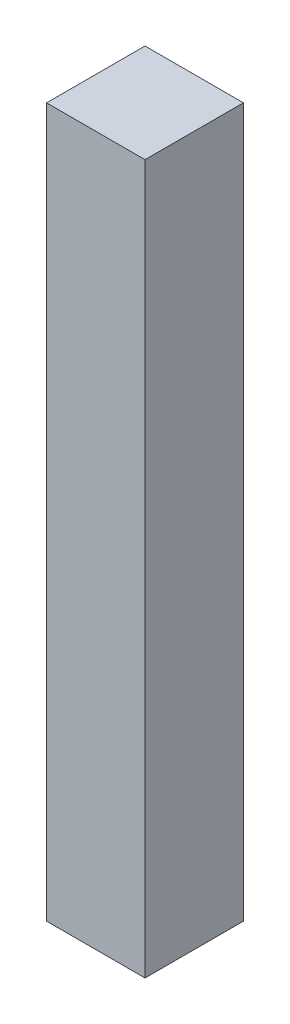
ISO-10303-21;
HEADER;
FILE_DESCRIPTION(('STEP AP214'),'2;1');
FILE_NAME('part.step','',(''),(''),'','','');
FILE_SCHEMA(('AUTOMOTIVE_DESIGN { 1 0 10303 214 1 1 1 1 }'));
ENDSEC;
DATA;
#1=APPLICATION_CONTEXT('core data for automotive mechanical design processes');
#2=APPLICATION_PROTOCOL_DEFINITION('international standard','automotive_design',2000,#1);
#3=PRODUCT_CONTEXT('',#1,'mechanical');
#4=PRODUCT('Part','Part','',(#3));
#5=PRODUCT_RELATED_PRODUCT_CATEGORY('part','',(#4));
#6=PRODUCT_DEFINITION_FORMATION('','',#4);
#7=PRODUCT_DEFINITION_CONTEXT('part definition',#1,'design');
#8=PRODUCT_DEFINITION('design','',#6,#7);
#9=PRODUCT_DEFINITION_SHAPE('','',#8);
#10=(LENGTH_UNIT() NAMED_UNIT(*) SI_UNIT(.MILLI.,.METRE.));
#11=(NAMED_UNIT(*) PLANE_ANGLE_UNIT() SI_UNIT($,.RADIAN.));
#12=(NAMED_UNIT(*) SI_UNIT($,.STERADIAN.) SOLID_ANGLE_UNIT());
#13=UNCERTAINTY_MEASURE_WITH_UNIT(LENGTH_MEASURE(1.E-05),#10,'distance_accuracy_value','');
#14=(GEOMETRIC_REPRESENTATION_CONTEXT(3) GLOBAL_UNCERTAINTY_ASSIGNED_CONTEXT((#13)) GLOBAL_UNIT_ASSIGNED_CONTEXT((#10,
#11,#12)) REPRESENTATION_CONTEXT('',''));
#15=CARTESIAN_POINT('',(0.,0.,0.));
#16=DIRECTION('',(0.,0.,1.));
#17=DIRECTION('',(1.,0.,0.));
#18=AXIS2_PLACEMENT_3D('',#15,#16,#17);
#19=CARTESIAN_POINT('',(50.,720.,50.));
#20=DIRECTION('',(-1.,0.,0.));
#21=DIRECTION('',(0.,0.,1.));
#22=AXIS2_PLACEMENT_3D('',#19,#20,#21);
#23=PLANE('',#22);
#24=DIRECTION('',(0.,0.,-1.));
#25=VECTOR('',#24,1.);
#26=CARTESIAN_POINT('',(50.,0.,50.));
#27=LINE('',#26,#25);
#28=CARTESIAN_POINT('',(50.,0.,50.));
#29=VERTEX_POINT('',#28);
#30=CARTESIAN_POINT('',(50.,0.,-50.));
#31=VERTEX_POINT('',#30);
#32=EDGE_CURVE('E97',#29,#31,#27,.T.);
#33=ORIENTED_EDGE('',*,*,#32,.T.);
#34=DIRECTION('',(0.,-1.,0.));
#35=VECTOR('',#34,1.);
#36=CARTESIAN_POINT('',(50.,720.,-50.));
#37=LINE('',#36,#35);
#38=CARTESIAN_POINT('',(50.,720.,-50.));
#39=VERTEX_POINT('',#38);
#40=EDGE_CURVE('E11',#39,#31,#37,.T.);
#41=ORIENTED_EDGE('',*,*,#40,.F.);
#42=DIRECTION('',(0.,0.,-1.));
#43=VECTOR('',#42,1.);
#44=CARTESIAN_POINT('',(50.,720.,50.));
#45=LINE('',#44,#43);
#46=CARTESIAN_POINT('',(50.,720.,50.));
#47=VERTEX_POINT('',#46);
#48=EDGE_CURVE('E85',#47,#39,#45,.T.);
#49=ORIENTED_EDGE('',*,*,#48,.F.);
#50=DIRECTION('',(0.,-1.,0.));
#51=VECTOR('',#50,1.);
#52=CARTESIAN_POINT('',(50.,720.,50.));
#53=LINE('',#52,#51);
#54=EDGE_CURVE('E93',#47,#29,#53,.T.);
#55=ORIENTED_EDGE('',*,*,#54,.T.);
#56=EDGE_LOOP('',(#33,#41,#49,#55));
#57=FACE_BOUND('',#56,.T.);
#58=ADVANCED_FACE('F34',(#57),#23,.F.);
#59=CARTESIAN_POINT('',(-50.,720.,-50.));
#60=DIRECTION('',(0.,0.,1.));
#61=DIRECTION('',(1.,0.,0.));
#62=AXIS2_PLACEMENT_3D('',#59,#60,#61);
#63=PLANE('',#62);
#64=DIRECTION('',(-1.,0.,0.));
#65=VECTOR('',#64,1.);
#66=CARTESIAN_POINT('',(-50.,0.,-50.));
#67=LINE('',#66,#65);
#68=CARTESIAN_POINT('',(-50.,0.,-50.));
#69=VERTEX_POINT('',#68);
#70=EDGE_CURVE('E89',#31,#69,#67,.T.);
#71=ORIENTED_EDGE('',*,*,#70,.T.);
#72=DIRECTION('',(0.,-1.,0.));
#73=VECTOR('',#72,1.);
#74=CARTESIAN_POINT('',(-50.,720.,-50.));
#75=LINE('',#74,#73);
#76=CARTESIAN_POINT('',(-50.,720.,-50.));
#77=VERTEX_POINT('',#76);
#78=EDGE_CURVE('E42',#77,#69,#75,.T.);
#79=ORIENTED_EDGE('',*,*,#78,.F.);
#80=DIRECTION('',(-1.,0.,0.));
#81=VECTOR('',#80,1.);
#82=CARTESIAN_POINT('',(-50.,720.,-50.));
#83=LINE('',#82,#81);
#84=EDGE_CURVE('E80',#39,#77,#83,.T.);
#85=ORIENTED_EDGE('',*,*,#84,.F.);
#86=ORIENTED_EDGE('',*,*,#40,.T.);
#87=EDGE_LOOP('',(#71,#79,#85,#86));
#88=FACE_BOUND('',#87,.T.);
#89=ADVANCED_FACE('F88',(#88),#63,.F.);
#90=CARTESIAN_POINT('',(-50.,720.,50.));
#91=DIRECTION('',(1.,0.,0.));
#92=DIRECTION('',(0.,0.,-1.));
#93=AXIS2_PLACEMENT_3D('',#90,#91,#92);
#94=PLANE('',#93);
#95=DIRECTION('',(0.,0.,1.));
#96=VECTOR('',#95,1.);
#97=CARTESIAN_POINT('',(-50.,0.,50.));
#98=LINE('',#97,#96);
#99=CARTESIAN_POINT('',(-50.,0.,50.));
#100=VERTEX_POINT('',#99);
#101=EDGE_CURVE('E67',#69,#100,#98,.T.);
#102=ORIENTED_EDGE('',*,*,#101,.T.);
#103=DIRECTION('',(0.,-1.,0.));
#104=VECTOR('',#103,1.);
#105=CARTESIAN_POINT('',(-50.,720.,50.));
#106=LINE('',#105,#104);
#107=CARTESIAN_POINT('',(-50.,720.,50.));
#108=VERTEX_POINT('',#107);
#109=EDGE_CURVE('E90',#108,#100,#106,.T.);
#110=ORIENTED_EDGE('',*,*,#109,.F.);
#111=DIRECTION('',(0.,0.,1.));
#112=VECTOR('',#111,1.);
#113=CARTESIAN_POINT('',(-50.,720.,50.));
#114=LINE('',#113,#112);
#115=EDGE_CURVE('E83',#77,#108,#114,.T.);
#116=ORIENTED_EDGE('',*,*,#115,.F.);
#117=ORIENTED_EDGE('',*,*,#78,.T.);
#118=EDGE_LOOP('',(#102,#110,#116,#117));
#119=FACE_BOUND('',#118,.T.);
#120=ADVANCED_FACE('F91',(#119),#94,.F.);
#121=CARTESIAN_POINT('',(-50.,720.,50.));
#122=DIRECTION('',(0.,0.,-1.));
#123=DIRECTION('',(-1.,0.,0.));
#124=AXIS2_PLACEMENT_3D('',#121,#122,#123);
#125=PLANE('',#124);
#126=DIRECTION('',(1.,0.,0.));
#127=VECTOR('',#126,1.);
#128=CARTESIAN_POINT('',(-50.,0.,50.));
#129=LINE('',#128,#127);
#130=EDGE_CURVE('E73',#100,#29,#129,.T.);
#131=ORIENTED_EDGE('',*,*,#130,.T.);
#132=ORIENTED_EDGE('',*,*,#54,.F.);
#133=DIRECTION('',(1.,0.,0.));
#134=VECTOR('',#133,1.);
#135=CARTESIAN_POINT('',(-50.,720.,50.));
#136=LINE('',#135,#134);
#137=EDGE_CURVE('E50',#108,#47,#136,.T.);
#138=ORIENTED_EDGE('',*,*,#137,.F.);
#139=ORIENTED_EDGE('',*,*,#109,.T.);
#140=EDGE_LOOP('',(#131,#132,#138,#139));
#141=FACE_BOUND('',#140,.T.);
#142=ADVANCED_FACE('F104',(#141),#125,.F.);
#143=CARTESIAN_POINT('',(0.,720.,0.));
#144=DIRECTION('',(0.,-1.,0.));
#145=DIRECTION('',(0.,0.,-1.));
#146=AXIS2_PLACEMENT_3D('',#143,#144,#145);
#147=PLANE('',#146);
#148=ORIENTED_EDGE('',*,*,#48,.T.);
#149=ORIENTED_EDGE('',*,*,#84,.T.);
#150=ORIENTED_EDGE('',*,*,#115,.T.);
#151=ORIENTED_EDGE('',*,*,#137,.T.);
#152=EDGE_LOOP('',(#148,#149,#150,#151));
#153=FACE_BOUND('',#152,.T.);
#154=ADVANCED_FACE('F81',(#153),#147,.F.);
#155=CARTESIAN_POINT('',(0.,0.,0.));
#156=DIRECTION('',(0.,-1.,0.));
#157=DIRECTION('',(0.,0.,-1.));
#158=AXIS2_PLACEMENT_3D('',#155,#156,#157);
#159=PLANE('',#158);
#160=ORIENTED_EDGE('',*,*,#32,.F.);
#161=ORIENTED_EDGE('',*,*,#130,.F.);
#162=ORIENTED_EDGE('',*,*,#101,.F.);
#163=ORIENTED_EDGE('',*,*,#70,.F.);
#164=EDGE_LOOP('',(#160,#161,#162,#163));
#165=FACE_BOUND('',#164,.T.);
#166=ADVANCED_FACE('F107',(#165),#159,.T.);
#167=CLOSED_SHELL('',(#58,#89,#120,#142,#154,#166));
#168=MANIFOLD_SOLID_BREP('B2',#167);
#169=ADVANCED_BREP_SHAPE_REPRESENTATION('',(#18,#168),#14);
#170=SHAPE_DEFINITION_REPRESENTATION(#9,#169);
ENDSEC;
END-ISO-10303-21;
